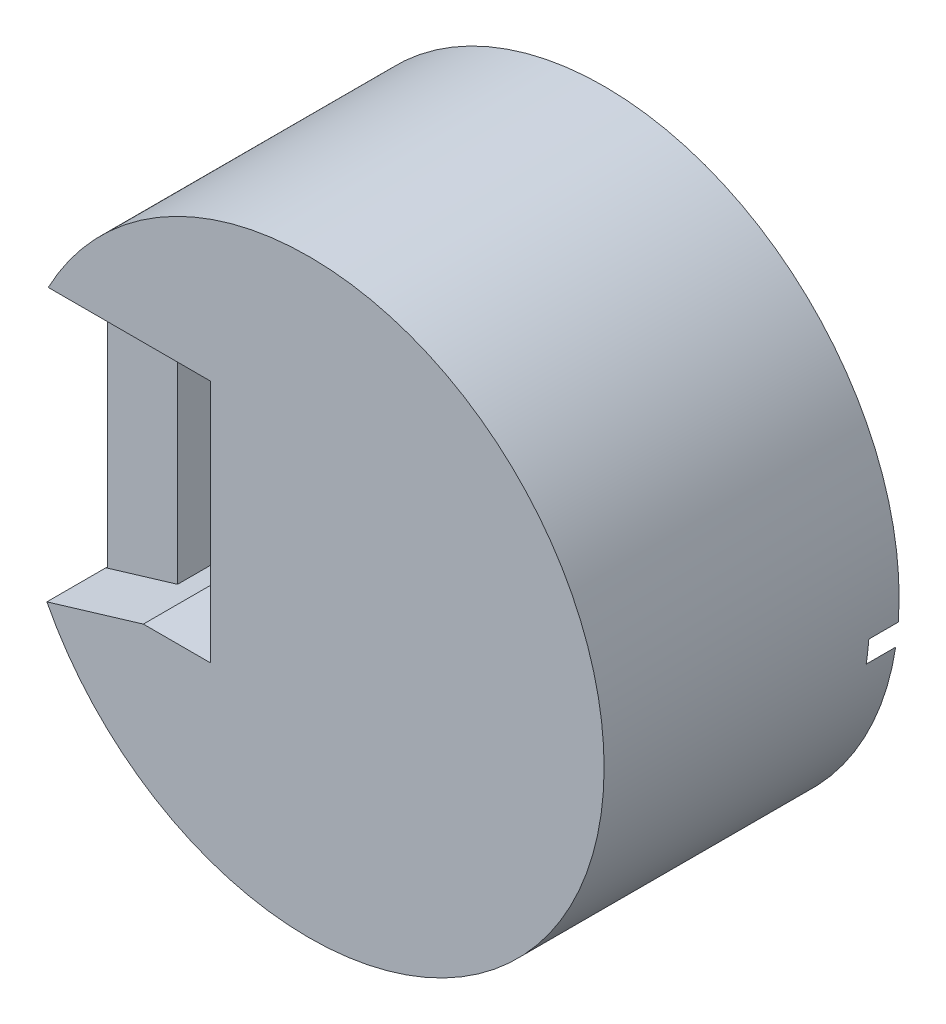
ISO-10303-21;
HEADER;
FILE_DESCRIPTION(('STEP AP214'),'2;1');
FILE_NAME('part.step','',(''),(''),'','','');
FILE_SCHEMA(('AUTOMOTIVE_DESIGN { 1 0 10303 214 1 1 1 1 }'));
ENDSEC;
DATA;
#1=APPLICATION_CONTEXT('core data for automotive mechanical design processes');
#2=APPLICATION_PROTOCOL_DEFINITION('international standard','automotive_design',2000,#1);
#3=PRODUCT_CONTEXT('',#1,'mechanical');
#4=PRODUCT('Part','Part','',(#3));
#5=PRODUCT_RELATED_PRODUCT_CATEGORY('part','',(#4));
#6=PRODUCT_DEFINITION_FORMATION('','',#4);
#7=PRODUCT_DEFINITION_CONTEXT('part definition',#1,'design');
#8=PRODUCT_DEFINITION('design','',#6,#7);
#9=PRODUCT_DEFINITION_SHAPE('','',#8);
#10=(LENGTH_UNIT() NAMED_UNIT(*) SI_UNIT(.MILLI.,.METRE.));
#11=(NAMED_UNIT(*) PLANE_ANGLE_UNIT() SI_UNIT($,.RADIAN.));
#12=(NAMED_UNIT(*) SI_UNIT($,.STERADIAN.) SOLID_ANGLE_UNIT());
#13=UNCERTAINTY_MEASURE_WITH_UNIT(LENGTH_MEASURE(1.E-05),#10,'distance_accuracy_value','');
#14=(GEOMETRIC_REPRESENTATION_CONTEXT(3) GLOBAL_UNCERTAINTY_ASSIGNED_CONTEXT((#13)) GLOBAL_UNIT_ASSIGNED_CONTEXT((#10,
#11,#12)) REPRESENTATION_CONTEXT('',''));
#15=CARTESIAN_POINT('',(0.,0.,0.));
#16=DIRECTION('',(0.,0.,1.));
#17=DIRECTION('',(1.,0.,0.));
#18=AXIS2_PLACEMENT_3D('',#15,#16,#17);
#19=CARTESIAN_POINT('',(-5.61911394926717,4.67121926585667,0.));
#20=DIRECTION('',(-1.,0.,0.));
#21=DIRECTION('',(0.,-1.,0.));
#22=AXIS2_PLACEMENT_3D('',#19,#20,#21);
#23=PLANE('',#22);
#24=DIRECTION('',(0.,1.,0.));
#25=VECTOR('',#24,1.);
#26=CARTESIAN_POINT('',(-5.61911394926717,-3.59998351394886,8.));
#27=LINE('',#26,#25);
#28=CARTESIAN_POINT('',(-5.61911394926717,4.61463523566507,8.));
#29=VERTEX_POINT('',#28);
#30=CARTESIAN_POINT('',(-5.61911394926717,4.67121926585667,8.));
#31=VERTEX_POINT('',#30);
#32=EDGE_CURVE('E263',#29,#31,#27,.T.);
#33=ORIENTED_EDGE('',*,*,#32,.F.);
#34=DIRECTION('',(0.,0.,1.));
#35=VECTOR('',#34,1.);
#36=CARTESIAN_POINT('',(-5.61911394926717,4.61463523566507,0.));
#37=LINE('',#36,#35);
#38=CARTESIAN_POINT('',(-5.61911394926717,4.61463523566507,2.));
#39=VERTEX_POINT('',#38);
#40=EDGE_CURVE('E215',#39,#29,#37,.T.);
#41=ORIENTED_EDGE('',*,*,#40,.F.);
#42=DIRECTION('',(0.,-1.,0.));
#43=VECTOR('',#42,1.);
#44=CARTESIAN_POINT('',(-5.61911394926717,-4.63368237489943,2.));
#45=LINE('',#44,#43);
#46=CARTESIAN_POINT('',(-5.61911394926717,4.67121926585667,2.));
#47=VERTEX_POINT('',#46);
#48=EDGE_CURVE('E242',#47,#39,#45,.T.);
#49=ORIENTED_EDGE('',*,*,#48,.F.);
#50=DIRECTION('',(0.,0.,1.));
#51=VECTOR('',#50,1.);
#52=CARTESIAN_POINT('',(-5.61911394926717,4.67121926585667,0.));
#53=LINE('',#52,#51);
#54=EDGE_CURVE('E296',#47,#31,#53,.T.);
#55=ORIENTED_EDGE('',*,*,#54,.T.);
#56=EDGE_LOOP('',(#33,#41,#49,#55));
#57=FACE_BOUND('',#56,.T.);
#58=ADVANCED_FACE('F33',(#57),#23,.F.);
#59=CARTESIAN_POINT('',(0.,0.,10.));
#60=DIRECTION('',(0.,0.,-1.));
#61=DIRECTION('',(-1.,0.,0.));
#62=AXIS2_PLACEMENT_3D('',#59,#60,#61);
#63=CYLINDRICAL_SURFACE('',#62,10.);
#64=CARTESIAN_POINT('',(0.,0.,0.999999999999999));
#65=DIRECTION('',(0.,0.,1.));
#66=DIRECTION('',(1.,0.,0.));
#67=AXIS2_PLACEMENT_3D('',#64,#65,#66);
#68=CIRCLE('',#67,10.);
#69=CARTESIAN_POINT('',(9.88304902535052,-1.52490719800193,1.));
#70=VERTEX_POINT('',#69);
#71=CARTESIAN_POINT('',(9.97214506800817,-0.745870459664688,1.));
#72=VERTEX_POINT('',#71);
#73=EDGE_CURVE('E11',#70,#72,#68,.T.);
#74=ORIENTED_EDGE('',*,*,#73,.T.);
#75=DIRECTION('',(0.,0.,-1.));
#76=VECTOR('',#75,1.);
#77=CARTESIAN_POINT('',(9.97214506800816,-0.745870459664682,0.5));
#78=LINE('',#77,#76);
#79=CARTESIAN_POINT('',(9.97214506800816,-0.745870459664682,0.));
#80=VERTEX_POINT('',#79);
#81=EDGE_CURVE('E200',#72,#80,#78,.T.);
#82=ORIENTED_EDGE('',*,*,#81,.T.);
#83=CARTESIAN_POINT('',(0.,0.,0.));
#84=DIRECTION('',(0.,0.,1.));
#85=DIRECTION('',(1.,0.,0.));
#86=AXIS2_PLACEMENT_3D('',#83,#84,#85);
#87=CIRCLE('',#86,10.);
#88=CARTESIAN_POINT('',(-8.84192912040633,4.67121926585667,0.));
#89=VERTEX_POINT('',#88);
#90=EDGE_CURVE('E299',#80,#89,#87,.T.);
#91=ORIENTED_EDGE('',*,*,#90,.T.);
#92=DIRECTION('',(0.,0.,1.));
#93=VECTOR('',#92,1.);
#94=CARTESIAN_POINT('',(-8.84192912040633,4.67121926585667,8.));
#95=LINE('',#94,#93);
#96=CARTESIAN_POINT('',(-8.84192912040633,4.67121926585667,10.));
#97=VERTEX_POINT('',#96);
#98=EDGE_CURVE('E271',#89,#97,#95,.T.);
#99=ORIENTED_EDGE('',*,*,#98,.T.);
#100=CARTESIAN_POINT('',(0.,0.,10.));
#101=DIRECTION('',(0.,0.,1.));
#102=DIRECTION('',(1.,0.,0.));
#103=AXIS2_PLACEMENT_3D('',#100,#101,#102);
#104=CIRCLE('',#103,10.);
#105=CARTESIAN_POINT('',(-8.888807860964,-4.58138568676167,10.));
#106=VERTEX_POINT('',#105);
#107=EDGE_CURVE('E306',#106,#97,#104,.T.);
#108=ORIENTED_EDGE('',*,*,#107,.F.);
#109=DIRECTION('',(0.,0.,1.));
#110=VECTOR('',#109,1.);
#111=CARTESIAN_POINT('',(-8.888807860964,-4.58138568676167,8.));
#112=LINE('',#111,#110);
#113=CARTESIAN_POINT('',(-8.888807860964,-4.58138568676167,8.));
#114=VERTEX_POINT('',#113);
#115=EDGE_CURVE('E269',#114,#106,#112,.T.);
#116=ORIENTED_EDGE('',*,*,#115,.F.);
#117=CARTESIAN_POINT('',(0.,0.,533.622464813771));
#118=DIRECTION('',(0.,-0.999962016836549,0.00871578362401887));
#119=DIRECTION('',(0.,-0.00871578362401887,-0.999962016836549));
#120=AXIS2_PLACEMENT_3D('',#117,#118,#119);
#121=ELLIPSE('',#120,1147.34376521717,10.);
#122=CARTESIAN_POINT('',(-8.86165828998988,-4.63368237489943,2.));
#123=VERTEX_POINT('',#122);
#124=EDGE_CURVE('E237',#114,#123,#121,.T.);
#125=ORIENTED_EDGE('',*,*,#124,.T.);
#126=DIRECTION('',(0.,0.,-1.));
#127=VECTOR('',#126,1.);
#128=CARTESIAN_POINT('',(-8.86165828998988,-4.63368237489943,2.));
#129=LINE('',#128,#127);
#130=CARTESIAN_POINT('',(-8.86165828998988,-4.63368237489943,0.));
#131=VERTEX_POINT('',#130);
#132=EDGE_CURVE('E255',#123,#131,#129,.T.);
#133=ORIENTED_EDGE('',*,*,#132,.T.);
#134=CARTESIAN_POINT('',(9.88304902535052,-1.52490719800193,0.));
#135=VERTEX_POINT('',#134);
#136=EDGE_CURVE('E310',#131,#135,#87,.T.);
#137=ORIENTED_EDGE('',*,*,#136,.T.);
#138=DIRECTION('',(0.,0.,-1.));
#139=VECTOR('',#138,1.);
#140=CARTESIAN_POINT('',(9.88304902535052,-1.52490719800192,0.5));
#141=LINE('',#140,#139);
#142=EDGE_CURVE('E48',#135,#70,#141,.F.);
#143=ORIENTED_EDGE('',*,*,#142,.T.);
#144=EDGE_LOOP('',(#74,#82,#91,#99,#108,#116,#125,#133,#137,#143));
#145=FACE_BOUND('',#144,.T.);
#146=ADVANCED_FACE('F35',(#145),#63,.T.);
#147=CARTESIAN_POINT('',(0.,0.,10.));
#148=DIRECTION('',(0.,0.,1.));
#149=DIRECTION('',(1.,0.,0.));
#150=AXIS2_PLACEMENT_3D('',#147,#148,#149);
#151=PLANE('',#150);
#152=ORIENTED_EDGE('',*,*,#107,.T.);
#153=DIRECTION('',(1.,0.,0.));
#154=VECTOR('',#153,1.);
#155=CARTESIAN_POINT('',(-5.61911394926717,4.67121926585667,10.));
#156=LINE('',#155,#154);
#157=CARTESIAN_POINT('',(-3.33496844270087,4.67121926585667,10.));
#158=VERTEX_POINT('',#157);
#159=EDGE_CURVE('E283',#97,#158,#156,.T.);
#160=ORIENTED_EDGE('',*,*,#159,.T.);
#161=DIRECTION('',(0.,-1.,0.));
#162=VECTOR('',#161,1.);
#163=CARTESIAN_POINT('',(-3.33496844270087,4.67121926585667,10.));
#164=LINE('',#163,#162);
#165=CARTESIAN_POINT('',(-3.33496844270087,-3.59998351394886,10.));
#166=VERTEX_POINT('',#165);
#167=EDGE_CURVE('E291',#158,#166,#164,.T.);
#168=ORIENTED_EDGE('',*,*,#167,.T.);
#169=DIRECTION('',(1.,0.,0.));
#170=VECTOR('',#169,1.);
#171=CARTESIAN_POINT('',(-5.61911394926717,-3.59998351394886,10.));
#172=LINE('',#171,#170);
#173=CARTESIAN_POINT('',(-5.61911394926717,-3.59998351394886,10.));
#174=VERTEX_POINT('',#173);
#175=EDGE_CURVE('E274',#174,#166,#172,.T.);
#176=ORIENTED_EDGE('',*,*,#175,.F.);
#177=DIRECTION('',(0.957786448554078,0.287480641028515,0.));
#178=VECTOR('',#177,1.);
#179=CARTESIAN_POINT('',(-8.888807860964,-4.58138568676167,10.));
#180=LINE('',#179,#178);
#181=EDGE_CURVE('E258',#106,#174,#180,.T.);
#182=ORIENTED_EDGE('',*,*,#181,.F.);
#183=EDGE_LOOP('',(#152,#160,#168,#176,#182));
#184=FACE_BOUND('',#183,.T.);
#185=ADVANCED_FACE('F351',(#184),#151,.T.);
#186=CARTESIAN_POINT('',(0.,0.,0.));
#187=DIRECTION('',(0.,0.,1.));
#188=DIRECTION('',(1.,0.,0.));
#189=AXIS2_PLACEMENT_3D('',#186,#187,#188);
#190=PLANE('',#189);
#191=CARTESIAN_POINT('',(5.92657743267057,2.84463253747091,0.));
#192=DIRECTION('',(0.,0.,-1.));
#193=DIRECTION('',(-1.,0.,0.));
#194=AXIS2_PLACEMENT_3D('',#191,#192,#193);
#195=CIRCLE('',#194,2.);
#196=CARTESIAN_POINT('',(3.92657743267057,2.84463253747091,0.));
#197=VERTEX_POINT('',#196);
#198=EDGE_CURVE('E203',#197,#197,#195,.T.);
#199=ORIENTED_EDGE('',*,*,#198,.F.);
#200=EDGE_LOOP('',(#199));
#201=FACE_BOUND('',#200,.T.);
#202=ORIENTED_EDGE('',*,*,#90,.F.);
#203=CARTESIAN_POINT('',(9.79552126093024,-1.03752376313694,0.));
#204=DIRECTION('',(0.,0.,-1.));
#205=DIRECTION('',(1.,0.,0.));
#206=AXIS2_PLACEMENT_3D('',#203,#204,#205);
#207=CIRCLE('',#206,0.340965714776392);
#208=CARTESIAN_POINT('',(9.50579077574522,-0.857763187349513,0.));
#209=VERTEX_POINT('',#208);
#210=EDGE_CURVE('E188',#209,#80,#207,.T.);
#211=ORIENTED_EDGE('',*,*,#210,.F.);
#212=CARTESIAN_POINT('',(4.41070903912012,1.8475777672736,0.));
#213=DIRECTION('',(0.,0.,1.));
#214=DIRECTION('',(-1.,0.,0.));
#215=AXIS2_PLACEMENT_3D('',#212,#213,#214);
#216=CIRCLE('',#215,5.76877175693854);
#217=CARTESIAN_POINT('',(1.70536808449703,-3.24750396935152,0.));
#218=VERTEX_POINT('',#217);
#219=EDGE_CURVE('E193',#218,#209,#216,.T.);
#220=ORIENTED_EDGE('',*,*,#219,.F.);
#221=CARTESIAN_POINT('',(1.58489052387231,-3.63607807421566,0.));
#222=DIRECTION('',(0.,0.,-1.));
#223=DIRECTION('',(1.,0.,0.));
#224=AXIS2_PLACEMENT_3D('',#221,#222,#223);
#225=CIRCLE('',#224,0.406822661100703);
#226=CARTESIAN_POINT('',(1.46441296324759,-4.02465217907981,0.));
#227=VERTEX_POINT('',#226);
#228=EDGE_CURVE('E190',#227,#218,#225,.T.);
#229=ORIENTED_EDGE('',*,*,#228,.F.);
#230=CARTESIAN_POINT('',(4.11056255030956,2.48965581721095,0.));
#231=DIRECTION('',(0.,0.,1.));
#232=DIRECTION('',(1.,0.,0.));
#233=AXIS2_PLACEMENT_3D('',#230,#231,#232);
#234=CIRCLE('',#233,7.03123860409003);
#235=EDGE_CURVE('E41',#227,#135,#234,.T.);
#236=ORIENTED_EDGE('',*,*,#235,.T.);
#237=ORIENTED_EDGE('',*,*,#136,.F.);
#238=DIRECTION('',(-1.,0.,0.));
#239=VECTOR('',#238,1.);
#240=CARTESIAN_POINT('',(-8.86165828998988,-4.63368237489943,0.));
#241=LINE('',#240,#239);
#242=CARTESIAN_POINT('',(-5.61911394926717,-4.63368237489943,0.));
#243=VERTEX_POINT('',#242);
#244=EDGE_CURVE('E253',#243,#131,#241,.T.);
#245=ORIENTED_EDGE('',*,*,#244,.F.);
#246=DIRECTION('',(0.,-1.,0.));
#247=VECTOR('',#246,1.);
#248=CARTESIAN_POINT('',(-5.61911394926717,-4.63368237489943,0.));
#249=LINE('',#248,#247);
#250=CARTESIAN_POINT('',(-5.61911394926717,-3.59998351394886,0.));
#251=VERTEX_POINT('',#250);
#252=EDGE_CURVE('E241',#251,#243,#249,.T.);
#253=ORIENTED_EDGE('',*,*,#252,.F.);
#254=DIRECTION('',(1.,0.,0.));
#255=VECTOR('',#254,1.);
#256=CARTESIAN_POINT('',(-5.61911394926717,-3.59998351394886,0.));
#257=LINE('',#256,#255);
#258=CARTESIAN_POINT('',(-3.33496844270087,-3.59998351394886,0.));
#259=VERTEX_POINT('',#258);
#260=EDGE_CURVE('E279',#251,#259,#257,.T.);
#261=ORIENTED_EDGE('',*,*,#260,.T.);
#262=DIRECTION('',(0.,-1.,0.));
#263=VECTOR('',#262,1.);
#264=CARTESIAN_POINT('',(-3.33496844270087,4.67121926585667,0.));
#265=LINE('',#264,#263);
#266=CARTESIAN_POINT('',(-3.33496844270087,4.67121926585667,0.));
#267=VERTEX_POINT('',#266);
#268=EDGE_CURVE('E282',#267,#259,#265,.T.);
#269=ORIENTED_EDGE('',*,*,#268,.F.);
#270=DIRECTION('',(1.,0.,0.));
#271=VECTOR('',#270,1.);
#272=CARTESIAN_POINT('',(-5.61911394926717,4.67121926585667,0.));
#273=LINE('',#272,#271);
#274=EDGE_CURVE('E286',#89,#267,#273,.T.);
#275=ORIENTED_EDGE('',*,*,#274,.F.);
#276=EDGE_LOOP('',(#202,#211,#220,#229,#236,#237,#245,#253,#261,#269,#275));
#277=FACE_BOUND('',#276,.T.);
#278=ADVANCED_FACE('F320',(#201,#277),#190,.F.);
#279=CARTESIAN_POINT('',(-5.61911394926717,4.67121926585667,0.));
#280=DIRECTION('',(0.,-1.,0.));
#281=DIRECTION('',(0.,0.,-1.));
#282=AXIS2_PLACEMENT_3D('',#279,#280,#281);
#283=PLANE('',#282);
#284=ORIENTED_EDGE('',*,*,#98,.F.);
#285=ORIENTED_EDGE('',*,*,#274,.T.);
#286=DIRECTION('',(0.,0.,1.));
#287=VECTOR('',#286,1.);
#288=CARTESIAN_POINT('',(-3.33496844270087,4.67121926585667,0.));
#289=LINE('',#288,#287);
#290=EDGE_CURVE('E300',#267,#158,#289,.T.);
#291=ORIENTED_EDGE('',*,*,#290,.T.);
#292=ORIENTED_EDGE('',*,*,#159,.F.);
#293=EDGE_LOOP('',(#284,#285,#291,#292));
#294=FACE_BOUND('',#293,.T.);
#295=DIRECTION('',(0.,0.,-1.));
#296=VECTOR('',#295,1.);
#297=CARTESIAN_POINT('',(-8.83496844270087,4.67121926585667,2.));
#298=LINE('',#297,#296);
#299=CARTESIAN_POINT('',(-8.83496844270087,4.67121926585667,8.));
#300=VERTEX_POINT('',#299);
#301=CARTESIAN_POINT('',(-8.83496844270087,4.67121926585667,2.));
#302=VERTEX_POINT('',#301);
#303=EDGE_CURVE('E231',#300,#302,#298,.T.);
#304=ORIENTED_EDGE('',*,*,#303,.F.);
#305=DIRECTION('',(-1.,0.,0.));
#306=VECTOR('',#305,1.);
#307=CARTESIAN_POINT('',(-5.61911394926717,4.67121926585667,8.));
#308=LINE('',#307,#306);
#309=EDGE_CURVE('E266',#31,#300,#308,.T.);
#310=ORIENTED_EDGE('',*,*,#309,.F.);
#311=ORIENTED_EDGE('',*,*,#54,.F.);
#312=DIRECTION('',(1.,0.,0.));
#313=VECTOR('',#312,1.);
#314=CARTESIAN_POINT('',(-5.61911394926717,4.67121926585667,2.));
#315=LINE('',#314,#313);
#316=EDGE_CURVE('E249',#302,#47,#315,.T.);
#317=ORIENTED_EDGE('',*,*,#316,.F.);
#318=EDGE_LOOP('',(#304,#310,#311,#317));
#319=FACE_BOUND('',#318,.T.);
#320=ADVANCED_FACE('F346',(#294,#319),#283,.T.);
#321=CARTESIAN_POINT('',(-3.33496844270087,4.67121926585667,0.));
#322=DIRECTION('',(-1.,0.,0.));
#323=DIRECTION('',(0.,-1.,0.));
#324=AXIS2_PLACEMENT_3D('',#321,#322,#323);
#325=PLANE('',#324);
#326=ORIENTED_EDGE('',*,*,#167,.F.);
#327=ORIENTED_EDGE('',*,*,#290,.F.);
#328=ORIENTED_EDGE('',*,*,#268,.T.);
#329=DIRECTION('',(0.,0.,1.));
#330=VECTOR('',#329,1.);
#331=CARTESIAN_POINT('',(-3.33496844270087,-3.59998351394886,0.));
#332=LINE('',#331,#330);
#333=EDGE_CURVE('E302',#259,#166,#332,.T.);
#334=ORIENTED_EDGE('',*,*,#333,.T.);
#335=EDGE_LOOP('',(#326,#327,#328,#334));
#336=FACE_BOUND('',#335,.T.);
#337=ADVANCED_FACE('F341',(#336),#325,.T.);
#338=CARTESIAN_POINT('',(-5.61911394926717,-3.59998351394886,0.));
#339=DIRECTION('',(0.,-1.,0.));
#340=DIRECTION('',(0.,0.,-1.));
#341=AXIS2_PLACEMENT_3D('',#338,#339,#340);
#342=PLANE('',#341);
#343=ORIENTED_EDGE('',*,*,#175,.T.);
#344=ORIENTED_EDGE('',*,*,#333,.F.);
#345=ORIENTED_EDGE('',*,*,#260,.F.);
#346=DIRECTION('',(0.,0.,1.));
#347=VECTOR('',#346,1.);
#348=CARTESIAN_POINT('',(-5.61911394926717,-3.59998351394886,0.));
#349=LINE('',#348,#347);
#350=CARTESIAN_POINT('',(-5.61911394926717,-3.59998351394886,2.));
#351=VERTEX_POINT('',#350);
#352=EDGE_CURVE('E288',#251,#351,#349,.T.);
#353=ORIENTED_EDGE('',*,*,#352,.T.);
#354=DIRECTION('',(0.,0.,1.));
#355=VECTOR('',#354,1.);
#356=CARTESIAN_POINT('',(-5.61911394926717,-3.59998351394886,8.));
#357=LINE('',#356,#355);
#358=EDGE_CURVE('E275',#351,#174,#357,.T.);
#359=ORIENTED_EDGE('',*,*,#358,.T.);
#360=EDGE_LOOP('',(#343,#344,#345,#353,#359));
#361=FACE_BOUND('',#360,.T.);
#362=ADVANCED_FACE('F336',(#361),#342,.F.);
#363=CARTESIAN_POINT('',(-2.33883169330325,0.0118497963243738,8.));
#364=DIRECTION('',(0.,0.,1.));
#365=DIRECTION('',(1.,0.,0.));
#366=AXIS2_PLACEMENT_3D('',#363,#364,#365);
#367=PLANE('',#366);
#368=DIRECTION('',(-1.,0.,0.));
#369=VECTOR('',#368,1.);
#370=CARTESIAN_POINT('',(-6.45825157427763,4.61463523566507,8.));
#371=LINE('',#370,#369);
#372=CARTESIAN_POINT('',(-6.45825157427763,4.61463523566507,8.));
#373=VERTEX_POINT('',#372);
#374=EDGE_CURVE('E207',#29,#373,#371,.T.);
#375=ORIENTED_EDGE('',*,*,#374,.F.);
#376=ORIENTED_EDGE('',*,*,#32,.T.);
#377=ORIENTED_EDGE('',*,*,#309,.T.);
#378=DIRECTION('',(0.,1.,0.));
#379=VECTOR('',#378,1.);
#380=CARTESIAN_POINT('',(-8.83496844270087,4.67121926585667,8.));
#381=LINE('',#380,#379);
#382=CARTESIAN_POINT('',(-8.83496844270087,-4.56522572699375,8.));
#383=VERTEX_POINT('',#382);
#384=EDGE_CURVE('E227',#383,#300,#381,.T.);
#385=ORIENTED_EDGE('',*,*,#384,.F.);
#386=DIRECTION('',(0.957786448554078,0.287480641028515,0.));
#387=VECTOR('',#386,1.);
#388=CARTESIAN_POINT('',(-8.888807860964,-4.58138568676167,8.));
#389=LINE('',#388,#387);
#390=CARTESIAN_POINT('',(-6.45825157427763,-3.8518515819439,8.));
#391=VERTEX_POINT('',#390);
#392=EDGE_CURVE('E264',#383,#391,#389,.T.);
#393=ORIENTED_EDGE('',*,*,#392,.T.);
#394=DIRECTION('',(0.,-1.,0.));
#395=VECTOR('',#394,1.);
#396=CARTESIAN_POINT('',(-6.45825157427763,-3.8518515819439,8.));
#397=LINE('',#396,#395);
#398=EDGE_CURVE('E212',#373,#391,#397,.T.);
#399=ORIENTED_EDGE('',*,*,#398,.F.);
#400=EDGE_LOOP('',(#375,#376,#377,#385,#393,#399));
#401=FACE_BOUND('',#400,.T.);
#402=ADVANCED_FACE('F367',(#401),#367,.T.);
#403=CARTESIAN_POINT('',(-8.888807860964,-4.58138568676167,8.));
#404=DIRECTION('',(0.287480641028515,-0.957786448554078,0.));
#405=DIRECTION('',(0.957786448554078,0.287480641028515,0.));
#406=AXIS2_PLACEMENT_3D('',#403,#404,#405);
#407=PLANE('',#406);
#408=ORIENTED_EDGE('',*,*,#181,.T.);
#409=ORIENTED_EDGE('',*,*,#358,.F.);
#410=DIRECTION('',(0.957786448554079,0.287480641028515,0.));
#411=VECTOR('',#410,1.);
#412=CARTESIAN_POINT('',(-1.62185228615457,-2.40020109167184,2.));
#413=LINE('',#412,#411);
#414=CARTESIAN_POINT('',(-6.45825157427763,-3.8518515819439,2.));
#415=VERTEX_POINT('',#414);
#416=EDGE_CURVE('E217',#415,#351,#413,.T.);
#417=ORIENTED_EDGE('',*,*,#416,.F.);
#418=DIRECTION('',(0.,0.,1.));
#419=VECTOR('',#418,1.);
#420=CARTESIAN_POINT('',(-6.45825157427763,-3.8518515819439,0.));
#421=LINE('',#420,#419);
#422=EDGE_CURVE('E56',#415,#391,#421,.T.);
#423=ORIENTED_EDGE('',*,*,#422,.T.);
#424=ORIENTED_EDGE('',*,*,#392,.F.);
#425=EDGE_CURVE('E261',#114,#383,#389,.T.);
#426=ORIENTED_EDGE('',*,*,#425,.F.);
#427=ORIENTED_EDGE('',*,*,#115,.T.);
#428=EDGE_LOOP('',(#408,#409,#417,#423,#424,#426,#427));
#429=FACE_BOUND('',#428,.T.);
#430=ADVANCED_FACE('F353',(#429),#407,.F.);
#431=CARTESIAN_POINT('',(-2.34376684272772,0.00496948547010467,2.));
#432=DIRECTION('',(0.,0.,1.));
#433=DIRECTION('',(1.,0.,0.));
#434=AXIS2_PLACEMENT_3D('',#431,#432,#433);
#435=PLANE('',#434);
#436=ORIENTED_EDGE('',*,*,#48,.T.);
#437=DIRECTION('',(-1.,0.,0.));
#438=VECTOR('',#437,1.);
#439=CARTESIAN_POINT('',(-2.34376684272772,4.61463523566507,2.));
#440=LINE('',#439,#438);
#441=CARTESIAN_POINT('',(-6.45825157427763,4.61463523566507,2.));
#442=VERTEX_POINT('',#441);
#443=EDGE_CURVE('E315',#39,#442,#440,.T.);
#444=ORIENTED_EDGE('',*,*,#443,.T.);
#445=DIRECTION('',(0.,-1.,0.));
#446=VECTOR('',#445,1.);
#447=CARTESIAN_POINT('',(-6.45825157427763,0.00496948547010467,2.));
#448=LINE('',#447,#446);
#449=EDGE_CURVE('E309',#442,#415,#448,.T.);
#450=ORIENTED_EDGE('',*,*,#449,.T.);
#451=ORIENTED_EDGE('',*,*,#416,.T.);
#452=CARTESIAN_POINT('',(-5.61911394926717,-4.63368237489943,2.));
#453=VERTEX_POINT('',#452);
#454=EDGE_CURVE('E246',#351,#453,#45,.T.);
#455=ORIENTED_EDGE('',*,*,#454,.T.);
#456=DIRECTION('',(-1.,0.,0.));
#457=VECTOR('',#456,1.);
#458=CARTESIAN_POINT('',(-8.86165828998988,-4.63368237489943,2.));
#459=LINE('',#458,#457);
#460=CARTESIAN_POINT('',(-8.83496844270087,-4.63368237489943,2.));
#461=VERTEX_POINT('',#460);
#462=EDGE_CURVE('E245',#453,#461,#459,.T.);
#463=ORIENTED_EDGE('',*,*,#462,.T.);
#464=DIRECTION('',(0.,-1.,0.));
#465=VECTOR('',#464,1.);
#466=CARTESIAN_POINT('',(-8.83496844270087,-4.63368237489943,2.));
#467=LINE('',#466,#465);
#468=EDGE_CURVE('E222',#302,#461,#467,.T.);
#469=ORIENTED_EDGE('',*,*,#468,.F.);
#470=ORIENTED_EDGE('',*,*,#316,.T.);
#471=EDGE_LOOP('',(#436,#444,#450,#451,#455,#463,#469,#470));
#472=FACE_BOUND('',#471,.T.);
#473=ADVANCED_FACE('F375',(#472),#435,.F.);
#474=CARTESIAN_POINT('',(-5.61911394926717,-4.63368237489943,2.));
#475=DIRECTION('',(1.,0.,0.));
#476=DIRECTION('',(0.,0.,-1.));
#477=AXIS2_PLACEMENT_3D('',#474,#475,#476);
#478=PLANE('',#477);
#479=ORIENTED_EDGE('',*,*,#252,.T.);
#480=DIRECTION('',(0.,0.,-1.));
#481=VECTOR('',#480,1.);
#482=CARTESIAN_POINT('',(-5.61911394926717,-4.63368237489943,2.));
#483=LINE('',#482,#481);
#484=EDGE_CURVE('E251',#453,#243,#483,.T.);
#485=ORIENTED_EDGE('',*,*,#484,.F.);
#486=ORIENTED_EDGE('',*,*,#454,.F.);
#487=ORIENTED_EDGE('',*,*,#352,.F.);
#488=EDGE_LOOP('',(#479,#485,#486,#487));
#489=FACE_BOUND('',#488,.T.);
#490=ADVANCED_FACE('F378',(#489),#478,.F.);
#491=CARTESIAN_POINT('',(-8.86165828998988,-4.63368237489943,2.));
#492=DIRECTION('',(0.,-1.,0.));
#493=DIRECTION('',(0.,0.,-1.));
#494=AXIS2_PLACEMENT_3D('',#491,#492,#493);
#495=PLANE('',#494);
#496=ORIENTED_EDGE('',*,*,#244,.T.);
#497=ORIENTED_EDGE('',*,*,#132,.F.);
#498=DIRECTION('',(-1.,0.,0.));
#499=VECTOR('',#498,1.);
#500=CARTESIAN_POINT('',(-8.83496844270087,-4.63368237489943,2.));
#501=LINE('',#500,#499);
#502=EDGE_CURVE('E233',#461,#123,#501,.T.);
#503=ORIENTED_EDGE('',*,*,#502,.F.);
#504=ORIENTED_EDGE('',*,*,#462,.F.);
#505=ORIENTED_EDGE('',*,*,#484,.T.);
#506=EDGE_LOOP('',(#496,#497,#503,#504,#505));
#507=FACE_BOUND('',#506,.T.);
#508=ADVANCED_FACE('F328',(#507),#495,.F.);
#509=CARTESIAN_POINT('',(-8.83496844270087,4.67121926585667,8.));
#510=DIRECTION('',(0.,0.,1.));
#511=DIRECTION('',(1.,0.,0.));
#512=AXIS2_PLACEMENT_3D('',#509,#510,#511);
#513=PLANE('',#512);
#514=CARTESIAN_POINT('',(-8.83496844270087,-4.58138568676167,8.));
#515=VERTEX_POINT('',#514);
#516=EDGE_CURVE('E228',#515,#383,#381,.T.);
#517=ORIENTED_EDGE('',*,*,#516,.F.);
#518=DIRECTION('',(-1.,0.,0.));
#519=VECTOR('',#518,1.);
#520=CARTESIAN_POINT('',(-8.83496844270087,-4.58138568676167,8.));
#521=LINE('',#520,#519);
#522=EDGE_CURVE('E234',#515,#114,#521,.T.);
#523=ORIENTED_EDGE('',*,*,#522,.T.);
#524=ORIENTED_EDGE('',*,*,#425,.T.);
#525=EDGE_LOOP('',(#517,#523,#524));
#526=FACE_BOUND('',#525,.T.);
#527=ADVANCED_FACE('F359',(#526),#513,.F.);
#528=CARTESIAN_POINT('',(-8.83496844270087,-4.58138568676167,8.));
#529=DIRECTION('',(0.,-0.999962016836549,0.00871578362401887));
#530=DIRECTION('',(0.,-0.00871578362401887,-0.999962016836549));
#531=AXIS2_PLACEMENT_3D('',#528,#529,#530);
#532=PLANE('',#531);
#533=ORIENTED_EDGE('',*,*,#522,.F.);
#534=DIRECTION('',(0.,0.00871578362401887,0.999962016836549));
#535=VECTOR('',#534,1.);
#536=CARTESIAN_POINT('',(-8.83496844270087,-4.58138568676167,8.));
#537=LINE('',#536,#535);
#538=EDGE_CURVE('E224',#461,#515,#537,.T.);
#539=ORIENTED_EDGE('',*,*,#538,.F.);
#540=ORIENTED_EDGE('',*,*,#502,.T.);
#541=ORIENTED_EDGE('',*,*,#124,.F.);
#542=EDGE_LOOP('',(#533,#539,#540,#541));
#543=FACE_BOUND('',#542,.T.);
#544=ADVANCED_FACE('F430',(#543),#532,.F.);
#545=CARTESIAN_POINT('',(-8.83496844270087,0.,0.));
#546=DIRECTION('',(1.,0.,0.));
#547=DIRECTION('',(0.,0.,-1.));
#548=AXIS2_PLACEMENT_3D('',#545,#546,#547);
#549=PLANE('',#548);
#550=ORIENTED_EDGE('',*,*,#468,.T.);
#551=ORIENTED_EDGE('',*,*,#538,.T.);
#552=ORIENTED_EDGE('',*,*,#516,.T.);
#553=ORIENTED_EDGE('',*,*,#384,.T.);
#554=ORIENTED_EDGE('',*,*,#303,.T.);
#555=EDGE_LOOP('',(#550,#551,#552,#553,#554));
#556=FACE_BOUND('',#555,.T.);
#557=ADVANCED_FACE('F362',(#556),#549,.F.);
#558=CARTESIAN_POINT('',(-6.45825157427763,4.61463523566507,0.));
#559=DIRECTION('',(0.,1.,0.));
#560=DIRECTION('',(0.,0.,1.));
#561=AXIS2_PLACEMENT_3D('',#558,#559,#560);
#562=PLANE('',#561);
#563=ORIENTED_EDGE('',*,*,#40,.T.);
#564=ORIENTED_EDGE('',*,*,#374,.T.);
#565=DIRECTION('',(0.,0.,1.));
#566=VECTOR('',#565,1.);
#567=CARTESIAN_POINT('',(-6.45825157427763,4.61463523566507,0.));
#568=LINE('',#567,#566);
#569=EDGE_CURVE('E214',#442,#373,#568,.T.);
#570=ORIENTED_EDGE('',*,*,#569,.F.);
#571=ORIENTED_EDGE('',*,*,#443,.F.);
#572=EDGE_LOOP('',(#563,#564,#570,#571));
#573=FACE_BOUND('',#572,.T.);
#574=ADVANCED_FACE('F420',(#573),#562,.F.);
#575=CARTESIAN_POINT('',(-6.45825157427763,-3.8518515819439,0.));
#576=DIRECTION('',(-1.,0.,0.));
#577=DIRECTION('',(0.,0.,1.));
#578=AXIS2_PLACEMENT_3D('',#575,#576,#577);
#579=PLANE('',#578);
#580=ORIENTED_EDGE('',*,*,#569,.T.);
#581=ORIENTED_EDGE('',*,*,#398,.T.);
#582=ORIENTED_EDGE('',*,*,#422,.F.);
#583=ORIENTED_EDGE('',*,*,#449,.F.);
#584=EDGE_LOOP('',(#580,#581,#582,#583));
#585=FACE_BOUND('',#584,.T.);
#586=ADVANCED_FACE('F411',(#585),#579,.F.);
#587=CARTESIAN_POINT('',(5.92657743267057,2.84463253747091,1.));
#588=DIRECTION('',(0.,0.,-1.));
#589=DIRECTION('',(-1.,0.,0.));
#590=AXIS2_PLACEMENT_3D('',#587,#588,#589);
#591=CYLINDRICAL_SURFACE('',#590,2.);
#592=CARTESIAN_POINT('',(5.92657743267057,2.84463253747091,1.));
#593=DIRECTION('',(0.,0.,-1.));
#594=DIRECTION('',(-1.,0.,0.));
#595=AXIS2_PLACEMENT_3D('',#592,#593,#594);
#596=CIRCLE('',#595,2.);
#597=CARTESIAN_POINT('',(3.92657743267057,2.84463253747091,1.));
#598=VERTEX_POINT('',#597);
#599=EDGE_CURVE('E204',#598,#598,#596,.T.);
#600=ORIENTED_EDGE('',*,*,#599,.F.);
#601=EDGE_LOOP('',(#600));
#602=FACE_BOUND('',#601,.T.);
#603=ORIENTED_EDGE('',*,*,#198,.T.);
#604=EDGE_LOOP('',(#603));
#605=FACE_BOUND('',#604,.T.);
#606=ADVANCED_FACE('F408',(#602,#605),#591,.F.);
#607=CARTESIAN_POINT('',(5.92657743267057,2.84463253747091,1.));
#608=DIRECTION('',(0.,0.,-1.));
#609=DIRECTION('',(-1.,0.,0.));
#610=AXIS2_PLACEMENT_3D('',#607,#608,#609);
#611=PLANE('',#610);
#612=CARTESIAN_POINT('',(6.4985677902842,2.84463253747091,1.));
#613=DIRECTION('',(0.,0.,-1.));
#614=DIRECTION('',(-1.,0.,0.));
#615=AXIS2_PLACEMENT_3D('',#612,#613,#614);
#616=CIRCLE('',#615,0.598433568734144);
#617=CARTESIAN_POINT('',(5.90013422155006,2.84463253747091,1.));
#618=VERTEX_POINT('',#617);
#619=EDGE_CURVE('E621',#618,#618,#616,.T.);
#620=ORIENTED_EDGE('',*,*,#619,.F.);
#621=EDGE_LOOP('',(#620));
#622=FACE_BOUND('',#621,.T.);
#623=ORIENTED_EDGE('',*,*,#599,.T.);
#624=EDGE_LOOP('',(#623));
#625=FACE_BOUND('',#624,.T.);
#626=ADVANCED_FACE('F410',(#622,#625),#611,.T.);
#627=CARTESIAN_POINT('',(7.10311515002518,0.405027002068332,1.));
#628=DIRECTION('',(0.,0.,1.));
#629=DIRECTION('',(1.,0.,0.));
#630=AXIS2_PLACEMENT_3D('',#627,#628,#629);
#631=PLANE('',#630);
#632=CARTESIAN_POINT('',(4.11056255030956,2.48965581721095,1.));
#633=DIRECTION('',(0.,0.,-1.));
#634=DIRECTION('',(-1.,0.,0.));
#635=AXIS2_PLACEMENT_3D('',#632,#633,#634);
#636=CIRCLE('',#635,7.03123860409003);
#637=CARTESIAN_POINT('',(1.46441296324759,-4.02465217907981,1.));
#638=VERTEX_POINT('',#637);
#639=EDGE_CURVE('E164',#70,#638,#636,.T.);
#640=ORIENTED_EDGE('',*,*,#639,.T.);
#641=CARTESIAN_POINT('',(1.58489052387231,-3.63607807421566,1.));
#642=DIRECTION('',(0.,0.,-1.));
#643=DIRECTION('',(1.,0.,0.));
#644=AXIS2_PLACEMENT_3D('',#641,#642,#643);
#645=CIRCLE('',#644,0.406822661100703);
#646=CARTESIAN_POINT('',(1.70536808449703,-3.24750396935152,1.));
#647=VERTEX_POINT('',#646);
#648=EDGE_CURVE('E169',#638,#647,#645,.T.);
#649=ORIENTED_EDGE('',*,*,#648,.T.);
#650=CARTESIAN_POINT('',(4.41070903912012,1.8475777672736,1.));
#651=DIRECTION('',(0.,0.,1.));
#652=DIRECTION('',(-1.,0.,0.));
#653=AXIS2_PLACEMENT_3D('',#650,#651,#652);
#654=CIRCLE('',#653,5.76877175693854);
#655=CARTESIAN_POINT('',(9.50579077574522,-0.857763187349513,1.));
#656=VERTEX_POINT('',#655);
#657=EDGE_CURVE('E181',#647,#656,#654,.T.);
#658=ORIENTED_EDGE('',*,*,#657,.T.);
#659=CARTESIAN_POINT('',(9.79552126093024,-1.03752376313694,1.));
#660=DIRECTION('',(0.,0.,-1.));
#661=DIRECTION('',(1.,0.,0.));
#662=AXIS2_PLACEMENT_3D('',#659,#660,#661);
#663=CIRCLE('',#662,0.340965714776392);
#664=EDGE_CURVE('E172',#656,#72,#663,.T.);
#665=ORIENTED_EDGE('',*,*,#664,.T.);
#666=ORIENTED_EDGE('',*,*,#73,.F.);
#667=EDGE_LOOP('',(#640,#649,#658,#665,#666));
#668=FACE_BOUND('',#667,.T.);
#669=ADVANCED_FACE('F166',(#668),#631,.F.);
#670=CARTESIAN_POINT('',(9.79552126093024,-1.03752376313694,1.));
#671=DIRECTION('',(0.,0.,-1.));
#672=DIRECTION('',(-1.,0.,0.));
#673=AXIS2_PLACEMENT_3D('',#670,#671,#672);
#674=CYLINDRICAL_SURFACE('',#673,0.340965714776392);
#675=ORIENTED_EDGE('',*,*,#664,.F.);
#676=DIRECTION('',(0.,0.,-1.));
#677=VECTOR('',#676,1.);
#678=CARTESIAN_POINT('',(9.50579077574522,-0.857763187349513,1.));
#679=LINE('',#678,#677);
#680=EDGE_CURVE('E196',#656,#209,#679,.T.);
#681=ORIENTED_EDGE('',*,*,#680,.T.);
#682=ORIENTED_EDGE('',*,*,#210,.T.);
#683=ORIENTED_EDGE('',*,*,#81,.F.);
#684=EDGE_LOOP('',(#675,#681,#682,#683));
#685=FACE_BOUND('',#684,.T.);
#686=ADVANCED_FACE('F563',(#685),#674,.F.);
#687=CARTESIAN_POINT('',(4.11056255030956,2.48965581721095,1.));
#688=DIRECTION('',(0.,0.,-1.));
#689=DIRECTION('',(-1.,0.,0.));
#690=AXIS2_PLACEMENT_3D('',#687,#688,#689);
#691=CYLINDRICAL_SURFACE('',#690,7.03123860409003);
#692=ORIENTED_EDGE('',*,*,#235,.F.);
#693=DIRECTION('',(0.,0.,-1.));
#694=VECTOR('',#693,1.);
#695=CARTESIAN_POINT('',(1.46441296324759,-4.02465217907981,1.));
#696=LINE('',#695,#694);
#697=EDGE_CURVE('E175',#638,#227,#696,.T.);
#698=ORIENTED_EDGE('',*,*,#697,.F.);
#699=ORIENTED_EDGE('',*,*,#639,.F.);
#700=ORIENTED_EDGE('',*,*,#142,.F.);
#701=EDGE_LOOP('',(#692,#698,#699,#700));
#702=FACE_BOUND('',#701,.T.);
#703=ADVANCED_FACE('F176',(#702),#691,.F.);
#704=CARTESIAN_POINT('',(4.41070903912012,1.8475777672736,1.));
#705=DIRECTION('',(0.,0.,-1.));
#706=DIRECTION('',(-1.,0.,0.));
#707=AXIS2_PLACEMENT_3D('',#704,#705,#706);
#708=CYLINDRICAL_SURFACE('',#707,5.76877175693854);
#709=ORIENTED_EDGE('',*,*,#219,.T.);
#710=ORIENTED_EDGE('',*,*,#680,.F.);
#711=ORIENTED_EDGE('',*,*,#657,.F.);
#712=DIRECTION('',(0.,0.,-1.));
#713=VECTOR('',#712,1.);
#714=CARTESIAN_POINT('',(1.70536808449703,-3.24750396935152,1.));
#715=LINE('',#714,#713);
#716=EDGE_CURVE('E180',#647,#218,#715,.T.);
#717=ORIENTED_EDGE('',*,*,#716,.T.);
#718=EDGE_LOOP('',(#709,#710,#711,#717));
#719=FACE_BOUND('',#718,.T.);
#720=ADVANCED_FACE('F578',(#719),#708,.T.);
#721=CARTESIAN_POINT('',(1.58489052387231,-3.63607807421566,1.));
#722=DIRECTION('',(0.,0.,-1.));
#723=DIRECTION('',(-1.,0.,0.));
#724=AXIS2_PLACEMENT_3D('',#721,#722,#723);
#725=CYLINDRICAL_SURFACE('',#724,0.406822661100703);
#726=ORIENTED_EDGE('',*,*,#228,.T.);
#727=ORIENTED_EDGE('',*,*,#716,.F.);
#728=ORIENTED_EDGE('',*,*,#648,.F.);
#729=ORIENTED_EDGE('',*,*,#697,.T.);
#730=EDGE_LOOP('',(#726,#727,#728,#729));
#731=FACE_BOUND('',#730,.T.);
#732=ADVANCED_FACE('F183',(#731),#725,.F.);
#733=CARTESIAN_POINT('',(6.4985677902842,2.84463253747091,0.));
#734=DIRECTION('',(0.,0.,1.));
#735=DIRECTION('',(1.,0.,0.));
#736=AXIS2_PLACEMENT_3D('',#733,#734,#735);
#737=CYLINDRICAL_SURFACE('',#736,0.598433568734144);
#738=CARTESIAN_POINT('',(6.4985677902842,2.84463253747091,0.));
#739=DIRECTION('',(0.,0.,-1.));
#740=DIRECTION('',(-1.,0.,0.));
#741=AXIS2_PLACEMENT_3D('',#738,#739,#740);
#742=CIRCLE('',#741,0.598433568734144);
#743=CARTESIAN_POINT('',(5.90013422155006,2.84463253747091,0.));
#744=VERTEX_POINT('',#743);
#745=EDGE_CURVE('E191',#744,#744,#742,.T.);
#746=ORIENTED_EDGE('',*,*,#745,.F.);
#747=EDGE_LOOP('',(#746));
#748=FACE_BOUND('',#747,.T.);
#749=ORIENTED_EDGE('',*,*,#619,.T.);
#750=EDGE_LOOP('',(#749));
#751=FACE_BOUND('',#750,.T.);
#752=ADVANCED_FACE('F593',(#748,#751),#737,.T.);
#753=CARTESIAN_POINT('',(6.4985677902842,2.84463253747091,0.));
#754=DIRECTION('',(0.,0.,-1.));
#755=DIRECTION('',(-1.,0.,0.));
#756=AXIS2_PLACEMENT_3D('',#753,#754,#755);
#757=PLANE('',#756);
#758=ORIENTED_EDGE('',*,*,#745,.T.);
#759=EDGE_LOOP('',(#758));
#760=FACE_BOUND('',#759,.T.);
#761=ADVANCED_FACE('F600',(#760),#757,.T.);
#762=CLOSED_SHELL('',(#58,#146,#185,#278,#320,#337,#362,#402,#430,#473,#490,#508,#527,#544,#557,
#574,#586,#606,#626,#669,#686,#703,#720,#732,#752,#761));
#763=MANIFOLD_SOLID_BREP('B2',#762);
#764=ADVANCED_BREP_SHAPE_REPRESENTATION('',(#18,#763),#14);
#765=SHAPE_DEFINITION_REPRESENTATION(#9,#764);
ENDSEC;
END-ISO-10303-21;
